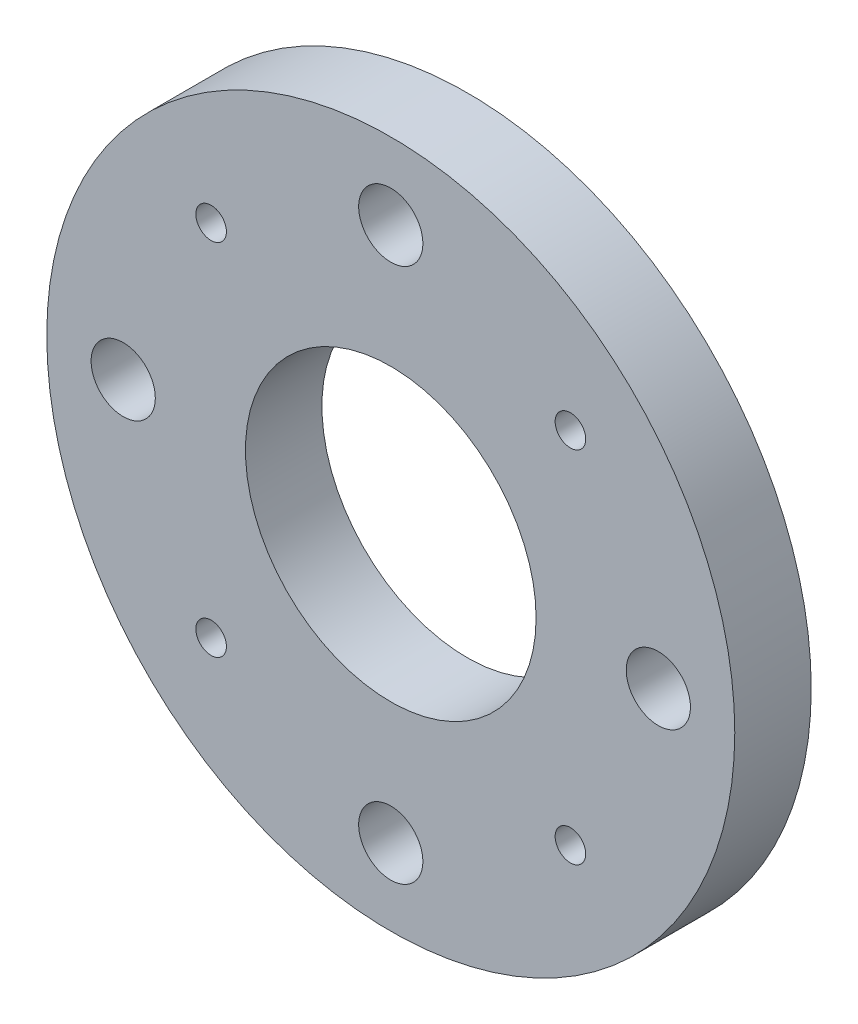
ISO-10303-21;
HEADER;
FILE_DESCRIPTION(('STEP AP214'),'2;1');
FILE_NAME('part.step','',(''),(''),'','','');
FILE_SCHEMA(('AUTOMOTIVE_DESIGN { 1 0 10303 214 1 1 1 1 }'));
ENDSEC;
DATA;
#1=APPLICATION_CONTEXT('core data for automotive mechanical design processes');
#2=APPLICATION_PROTOCOL_DEFINITION('international standard','automotive_design',2000,#1);
#3=PRODUCT_CONTEXT('',#1,'mechanical');
#4=PRODUCT('Part','Part','',(#3));
#5=PRODUCT_RELATED_PRODUCT_CATEGORY('part','',(#4));
#6=PRODUCT_DEFINITION_FORMATION('','',#4);
#7=PRODUCT_DEFINITION_CONTEXT('part definition',#1,'design');
#8=PRODUCT_DEFINITION('design','',#6,#7);
#9=PRODUCT_DEFINITION_SHAPE('','',#8);
#10=(LENGTH_UNIT() NAMED_UNIT(*) SI_UNIT(.MILLI.,.METRE.));
#11=(NAMED_UNIT(*) PLANE_ANGLE_UNIT() SI_UNIT($,.RADIAN.));
#12=(NAMED_UNIT(*) SI_UNIT($,.STERADIAN.) SOLID_ANGLE_UNIT());
#13=UNCERTAINTY_MEASURE_WITH_UNIT(LENGTH_MEASURE(1.E-05),#10,'distance_accuracy_value','');
#14=(GEOMETRIC_REPRESENTATION_CONTEXT(3) GLOBAL_UNCERTAINTY_ASSIGNED_CONTEXT((#13)) GLOBAL_UNIT_ASSIGNED_CONTEXT((#10,
#11,#12)) REPRESENTATION_CONTEXT('',''));
#15=CARTESIAN_POINT('',(0.,0.,0.));
#16=DIRECTION('',(0.,0.,1.));
#17=DIRECTION('',(1.,0.,0.));
#18=AXIS2_PLACEMENT_3D('',#15,#16,#17);
#19=CARTESIAN_POINT('',(0.,0.,10.));
#20=DIRECTION('',(0.,0.,1.));
#21=DIRECTION('',(1.,0.,0.));
#22=AXIS2_PLACEMENT_3D('',#19,#20,#21);
#23=PLANE('',#22);
#24=CARTESIAN_POINT('',(35.,0.,10.));
#25=DIRECTION('',(0.,0.,1.));
#26=DIRECTION('',(1.,0.,0.));
#27=AXIS2_PLACEMENT_3D('',#24,#25,#26);
#28=CIRCLE('',#27,4.2);
#29=CARTESIAN_POINT('',(39.2,0.,10.));
#30=VERTEX_POINT('',#29);
#31=EDGE_CURVE('E174',#30,#30,#28,.T.);
#32=ORIENTED_EDGE('',*,*,#31,.F.);
#33=EDGE_LOOP('',(#32));
#34=FACE_BOUND('',#33,.T.);
#35=CARTESIAN_POINT('',(0.,-35.,10.));
#36=DIRECTION('',(0.,0.,1.));
#37=DIRECTION('',(1.,0.,0.));
#38=AXIS2_PLACEMENT_3D('',#35,#36,#37);
#39=CIRCLE('',#38,4.2);
#40=CARTESIAN_POINT('',(4.2,-35.,10.));
#41=VERTEX_POINT('',#40);
#42=EDGE_CURVE('E176',#41,#41,#39,.T.);
#43=ORIENTED_EDGE('',*,*,#42,.F.);
#44=EDGE_LOOP('',(#43));
#45=FACE_BOUND('',#44,.T.);
#46=CARTESIAN_POINT('',(-35.,0.,10.));
#47=DIRECTION('',(0.,0.,1.));
#48=DIRECTION('',(1.,0.,0.));
#49=AXIS2_PLACEMENT_3D('',#46,#47,#48);
#50=CIRCLE('',#49,4.2);
#51=CARTESIAN_POINT('',(-30.8,0.,10.));
#52=VERTEX_POINT('',#51);
#53=EDGE_CURVE('E184',#52,#52,#50,.T.);
#54=ORIENTED_EDGE('',*,*,#53,.F.);
#55=EDGE_LOOP('',(#54));
#56=FACE_BOUND('',#55,.T.);
#57=CARTESIAN_POINT('',(0.,35.,10.));
#58=DIRECTION('',(0.,0.,1.));
#59=DIRECTION('',(1.,0.,0.));
#60=AXIS2_PLACEMENT_3D('',#57,#58,#59);
#61=CIRCLE('',#60,4.2);
#62=CARTESIAN_POINT('',(4.2,35.,10.));
#63=VERTEX_POINT('',#62);
#64=EDGE_CURVE('E190',#63,#63,#61,.T.);
#65=ORIENTED_EDGE('',*,*,#64,.F.);
#66=EDGE_LOOP('',(#65));
#67=FACE_BOUND('',#66,.T.);
#68=CARTESIAN_POINT('',(-23.5000000000003,23.4999999999999,10.));
#69=DIRECTION('',(0.,0.,1.));
#70=DIRECTION('',(1.,0.,0.));
#71=AXIS2_PLACEMENT_3D('',#68,#69,#70);
#72=CIRCLE('',#71,2.);
#73=CARTESIAN_POINT('',(-21.5000000000003,23.4999999999999,10.));
#74=VERTEX_POINT('',#73);
#75=EDGE_CURVE('E202',#74,#74,#72,.T.);
#76=ORIENTED_EDGE('',*,*,#75,.F.);
#77=EDGE_LOOP('',(#76));
#78=FACE_BOUND('',#77,.T.);
#79=CARTESIAN_POINT('',(23.4999999999997,23.4999999999999,10.));
#80=DIRECTION('',(0.,0.,1.));
#81=DIRECTION('',(1.,0.,0.));
#82=AXIS2_PLACEMENT_3D('',#79,#80,#81);
#83=CIRCLE('',#82,2.);
#84=CARTESIAN_POINT('',(25.4999999999997,23.4999999999999,10.));
#85=VERTEX_POINT('',#84);
#86=EDGE_CURVE('E57',#85,#85,#83,.T.);
#87=ORIENTED_EDGE('',*,*,#86,.F.);
#88=EDGE_LOOP('',(#87));
#89=FACE_BOUND('',#88,.T.);
#90=CARTESIAN_POINT('',(23.4999999999997,-23.5000000000001,10.));
#91=DIRECTION('',(0.,0.,1.));
#92=DIRECTION('',(1.,0.,0.));
#93=AXIS2_PLACEMENT_3D('',#90,#91,#92);
#94=CIRCLE('',#93,2.);
#95=CARTESIAN_POINT('',(25.4999999999997,-23.5000000000001,10.));
#96=VERTEX_POINT('',#95);
#97=EDGE_CURVE('E53',#96,#96,#94,.T.);
#98=ORIENTED_EDGE('',*,*,#97,.F.);
#99=EDGE_LOOP('',(#98));
#100=FACE_BOUND('',#99,.T.);
#101=CARTESIAN_POINT('',(-23.5000000000003,-23.5000000000001,10.));
#102=DIRECTION('',(0.,0.,1.));
#103=DIRECTION('',(1.,0.,0.));
#104=AXIS2_PLACEMENT_3D('',#101,#102,#103);
#105=CIRCLE('',#104,2.);
#106=CARTESIAN_POINT('',(-21.5000000000003,-23.5000000000001,10.));
#107=VERTEX_POINT('',#106);
#108=EDGE_CURVE('E49',#107,#107,#105,.T.);
#109=ORIENTED_EDGE('',*,*,#108,.F.);
#110=EDGE_LOOP('',(#109));
#111=FACE_BOUND('',#110,.T.);
#112=CARTESIAN_POINT('',(0.,0.,10.));
#113=DIRECTION('',(0.,0.,1.));
#114=DIRECTION('',(1.,0.,0.));
#115=AXIS2_PLACEMENT_3D('',#112,#113,#114);
#116=CIRCLE('',#115,45.);
#117=CARTESIAN_POINT('',(45.,0.,10.));
#118=VERTEX_POINT('',#117);
#119=EDGE_CURVE('E10',#118,#118,#116,.T.);
#120=ORIENTED_EDGE('',*,*,#119,.T.);
#121=EDGE_LOOP('',(#120));
#122=FACE_BOUND('',#121,.T.);
#123=CARTESIAN_POINT('',(0.,0.,10.));
#124=DIRECTION('',(0.,0.,1.));
#125=DIRECTION('',(1.,0.,0.));
#126=AXIS2_PLACEMENT_3D('',#123,#124,#125);
#127=CIRCLE('',#126,19.01);
#128=CARTESIAN_POINT('',(19.01,0.,10.));
#129=VERTEX_POINT('',#128);
#130=EDGE_CURVE('E41',#129,#129,#127,.T.);
#131=ORIENTED_EDGE('',*,*,#130,.F.);
#132=EDGE_LOOP('',(#131));
#133=FACE_BOUND('',#132,.T.);
#134=ADVANCED_FACE('F28',(#34,#45,#56,#67,#78,#89,#100,#111,#122,#133),#23,.T.);
#135=CARTESIAN_POINT('',(0.,0.,0.));
#136=DIRECTION('',(0.,0.,1.));
#137=DIRECTION('',(1.,0.,0.));
#138=AXIS2_PLACEMENT_3D('',#135,#136,#137);
#139=PLANE('',#138);
#140=CARTESIAN_POINT('',(35.,0.,0.));
#141=DIRECTION('',(0.,0.,1.));
#142=DIRECTION('',(1.,0.,0.));
#143=AXIS2_PLACEMENT_3D('',#140,#141,#142);
#144=CIRCLE('',#143,4.2);
#145=CARTESIAN_POINT('',(39.2,0.,0.));
#146=VERTEX_POINT('',#145);
#147=EDGE_CURVE('E172',#146,#146,#144,.T.);
#148=ORIENTED_EDGE('',*,*,#147,.T.);
#149=EDGE_LOOP('',(#148));
#150=FACE_BOUND('',#149,.T.);
#151=CARTESIAN_POINT('',(0.,-35.,0.));
#152=DIRECTION('',(0.,0.,1.));
#153=DIRECTION('',(1.,0.,0.));
#154=AXIS2_PLACEMENT_3D('',#151,#152,#153);
#155=CIRCLE('',#154,4.2);
#156=CARTESIAN_POINT('',(4.2,-35.,0.));
#157=VERTEX_POINT('',#156);
#158=EDGE_CURVE('E181',#157,#157,#155,.T.);
#159=ORIENTED_EDGE('',*,*,#158,.T.);
#160=EDGE_LOOP('',(#159));
#161=FACE_BOUND('',#160,.T.);
#162=CARTESIAN_POINT('',(-35.,0.,0.));
#163=DIRECTION('',(0.,0.,1.));
#164=DIRECTION('',(1.,0.,0.));
#165=AXIS2_PLACEMENT_3D('',#162,#163,#164);
#166=CIRCLE('',#165,4.2);
#167=CARTESIAN_POINT('',(-30.8,0.,0.));
#168=VERTEX_POINT('',#167);
#169=EDGE_CURVE('E187',#168,#168,#166,.T.);
#170=ORIENTED_EDGE('',*,*,#169,.T.);
#171=EDGE_LOOP('',(#170));
#172=FACE_BOUND('',#171,.T.);
#173=CARTESIAN_POINT('',(0.,35.,0.));
#174=DIRECTION('',(0.,0.,1.));
#175=DIRECTION('',(1.,0.,0.));
#176=AXIS2_PLACEMENT_3D('',#173,#174,#175);
#177=CIRCLE('',#176,4.2);
#178=CARTESIAN_POINT('',(4.2,35.,0.));
#179=VERTEX_POINT('',#178);
#180=EDGE_CURVE('E193',#179,#179,#177,.T.);
#181=ORIENTED_EDGE('',*,*,#180,.T.);
#182=EDGE_LOOP('',(#181));
#183=FACE_BOUND('',#182,.T.);
#184=CARTESIAN_POINT('',(-23.5000000000003,23.4999999999999,0.));
#185=DIRECTION('',(0.,0.,1.));
#186=DIRECTION('',(1.,0.,0.));
#187=AXIS2_PLACEMENT_3D('',#184,#185,#186);
#188=CIRCLE('',#187,1.65);
#189=CARTESIAN_POINT('',(-21.8500000000003,23.4999999999999,0.));
#190=VERTEX_POINT('',#189);
#191=EDGE_CURVE('E32',#190,#190,#188,.T.);
#192=ORIENTED_EDGE('',*,*,#191,.T.);
#193=EDGE_LOOP('',(#192));
#194=FACE_BOUND('',#193,.T.);
#195=CARTESIAN_POINT('',(23.4999999999997,23.4999999999999,0.));
#196=DIRECTION('',(0.,0.,1.));
#197=DIRECTION('',(1.,0.,0.));
#198=AXIS2_PLACEMENT_3D('',#195,#196,#197);
#199=CIRCLE('',#198,1.65);
#200=CARTESIAN_POINT('',(25.1499999999997,23.4999999999999,0.));
#201=VERTEX_POINT('',#200);
#202=EDGE_CURVE('E54',#201,#201,#199,.T.);
#203=ORIENTED_EDGE('',*,*,#202,.T.);
#204=EDGE_LOOP('',(#203));
#205=FACE_BOUND('',#204,.T.);
#206=CARTESIAN_POINT('',(23.4999999999997,-23.5000000000001,0.));
#207=DIRECTION('',(0.,0.,1.));
#208=DIRECTION('',(1.,0.,0.));
#209=AXIS2_PLACEMENT_3D('',#206,#207,#208);
#210=CIRCLE('',#209,1.65);
#211=CARTESIAN_POINT('',(25.1499999999997,-23.5000000000001,0.));
#212=VERTEX_POINT('',#211);
#213=EDGE_CURVE('E50',#212,#212,#210,.T.);
#214=ORIENTED_EDGE('',*,*,#213,.T.);
#215=EDGE_LOOP('',(#214));
#216=FACE_BOUND('',#215,.T.);
#217=CARTESIAN_POINT('',(-23.5000000000003,-23.5000000000001,0.));
#218=DIRECTION('',(0.,0.,1.));
#219=DIRECTION('',(1.,0.,0.));
#220=AXIS2_PLACEMENT_3D('',#217,#218,#219);
#221=CIRCLE('',#220,1.65);
#222=CARTESIAN_POINT('',(-21.8500000000003,-23.5000000000001,0.));
#223=VERTEX_POINT('',#222);
#224=EDGE_CURVE('E45',#223,#223,#221,.T.);
#225=ORIENTED_EDGE('',*,*,#224,.T.);
#226=EDGE_LOOP('',(#225));
#227=FACE_BOUND('',#226,.T.);
#228=CARTESIAN_POINT('',(0.,0.,0.));
#229=DIRECTION('',(0.,0.,1.));
#230=DIRECTION('',(1.,0.,0.));
#231=AXIS2_PLACEMENT_3D('',#228,#229,#230);
#232=CIRCLE('',#231,45.);
#233=CARTESIAN_POINT('',(45.,0.,0.));
#234=VERTEX_POINT('',#233);
#235=EDGE_CURVE('E36',#234,#234,#232,.T.);
#236=ORIENTED_EDGE('',*,*,#235,.F.);
#237=EDGE_LOOP('',(#236));
#238=FACE_BOUND('',#237,.T.);
#239=CARTESIAN_POINT('',(0.,0.,0.));
#240=DIRECTION('',(0.,0.,1.));
#241=DIRECTION('',(1.,0.,0.));
#242=AXIS2_PLACEMENT_3D('',#239,#240,#241);
#243=CIRCLE('',#242,19.01);
#244=CARTESIAN_POINT('',(19.01,0.,0.));
#245=VERTEX_POINT('',#244);
#246=EDGE_CURVE('E48',#245,#245,#243,.T.);
#247=ORIENTED_EDGE('',*,*,#246,.T.);
#248=EDGE_LOOP('',(#247));
#249=FACE_BOUND('',#248,.T.);
#250=ADVANCED_FACE('F92',(#150,#161,#172,#183,#194,#205,#216,#227,#238,#249),#139,.F.);
#251=CARTESIAN_POINT('',(0.,0.,10.));
#252=DIRECTION('',(0.,0.,-1.));
#253=DIRECTION('',(-1.,0.,0.));
#254=AXIS2_PLACEMENT_3D('',#251,#252,#253);
#255=CYLINDRICAL_SURFACE('',#254,45.);
#256=ORIENTED_EDGE('',*,*,#119,.F.);
#257=EDGE_LOOP('',(#256));
#258=FACE_BOUND('',#257,.T.);
#259=ORIENTED_EDGE('',*,*,#235,.T.);
#260=EDGE_LOOP('',(#259));
#261=FACE_BOUND('',#260,.T.);
#262=ADVANCED_FACE('F30',(#258,#261),#255,.T.);
#263=CARTESIAN_POINT('',(0.,0.,10.));
#264=DIRECTION('',(0.,0.,-1.));
#265=DIRECTION('',(-1.,0.,0.));
#266=AXIS2_PLACEMENT_3D('',#263,#264,#265);
#267=CYLINDRICAL_SURFACE('',#266,19.01);
#268=ORIENTED_EDGE('',*,*,#130,.T.);
#269=EDGE_LOOP('',(#268));
#270=FACE_BOUND('',#269,.T.);
#271=ORIENTED_EDGE('',*,*,#246,.F.);
#272=EDGE_LOOP('',(#271));
#273=FACE_BOUND('',#272,.T.);
#274=ADVANCED_FACE('F88',(#270,#273),#267,.F.);
#275=CARTESIAN_POINT('',(-23.5000000000003,-23.5000000000001,10.));
#276=DIRECTION('',(0.,0.,1.));
#277=DIRECTION('',(1.,0.,0.));
#278=AXIS2_PLACEMENT_3D('',#275,#276,#277);
#279=CYLINDRICAL_SURFACE('',#278,1.65);
#280=CARTESIAN_POINT('',(-23.5000000000003,-23.5000000000001,2.));
#281=DIRECTION('',(0.,0.,1.));
#282=DIRECTION('',(1.,0.,0.));
#283=AXIS2_PLACEMENT_3D('',#280,#281,#282);
#284=CIRCLE('',#283,1.65);
#285=CARTESIAN_POINT('',(-21.8500000000003,-23.5000000000001,2.));
#286=VERTEX_POINT('',#285);
#287=EDGE_CURVE('E52',#286,#286,#284,.T.);
#288=ORIENTED_EDGE('',*,*,#287,.T.);
#289=EDGE_LOOP('',(#288));
#290=FACE_BOUND('',#289,.T.);
#291=ORIENTED_EDGE('',*,*,#224,.F.);
#292=EDGE_LOOP('',(#291));
#293=FACE_BOUND('',#292,.T.);
#294=ADVANCED_FACE('F104',(#290,#293),#279,.F.);
#295=CARTESIAN_POINT('',(-23.5000000000003,-23.5000000000001,10.));
#296=DIRECTION('',(0.,0.,1.));
#297=DIRECTION('',(1.,0.,0.));
#298=AXIS2_PLACEMENT_3D('',#295,#296,#297);
#299=CYLINDRICAL_SURFACE('',#298,2.);
#300=CARTESIAN_POINT('',(-23.5000000000003,-23.5000000000001,2.));
#301=DIRECTION('',(0.,0.,1.));
#302=DIRECTION('',(1.,0.,0.));
#303=AXIS2_PLACEMENT_3D('',#300,#301,#302);
#304=CIRCLE('',#303,2.);
#305=CARTESIAN_POINT('',(-21.5000000000003,-23.5000000000001,2.));
#306=VERTEX_POINT('',#305);
#307=EDGE_CURVE('E79',#306,#306,#304,.T.);
#308=ORIENTED_EDGE('',*,*,#307,.F.);
#309=EDGE_LOOP('',(#308));
#310=FACE_BOUND('',#309,.T.);
#311=ORIENTED_EDGE('',*,*,#108,.T.);
#312=EDGE_LOOP('',(#311));
#313=FACE_BOUND('',#312,.T.);
#314=ADVANCED_FACE('F105',(#310,#313),#299,.F.);
#315=CARTESIAN_POINT('',(-21.8500000000003,-23.5000000000001,2.));
#316=DIRECTION('',(0.,0.,-1.));
#317=DIRECTION('',(-1.,0.,0.));
#318=AXIS2_PLACEMENT_3D('',#315,#316,#317);
#319=PLANE('',#318);
#320=ORIENTED_EDGE('',*,*,#287,.F.);
#321=EDGE_LOOP('',(#320));
#322=FACE_BOUND('',#321,.T.);
#323=ORIENTED_EDGE('',*,*,#307,.T.);
#324=EDGE_LOOP('',(#323));
#325=FACE_BOUND('',#324,.T.);
#326=ADVANCED_FACE('F108',(#322,#325),#319,.F.);
#327=CARTESIAN_POINT('',(23.4999999999997,-23.5000000000001,10.));
#328=DIRECTION('',(0.,0.,1.));
#329=DIRECTION('',(1.,0.,0.));
#330=AXIS2_PLACEMENT_3D('',#327,#328,#329);
#331=CYLINDRICAL_SURFACE('',#330,1.65);
#332=CARTESIAN_POINT('',(23.4999999999997,-23.5000000000001,2.));
#333=DIRECTION('',(0.,0.,1.));
#334=DIRECTION('',(1.,0.,0.));
#335=AXIS2_PLACEMENT_3D('',#332,#333,#334);
#336=CIRCLE('',#335,1.65);
#337=CARTESIAN_POINT('',(25.1499999999997,-23.5000000000001,2.));
#338=VERTEX_POINT('',#337);
#339=EDGE_CURVE('E56',#338,#338,#336,.T.);
#340=ORIENTED_EDGE('',*,*,#339,.T.);
#341=EDGE_LOOP('',(#340));
#342=FACE_BOUND('',#341,.T.);
#343=ORIENTED_EDGE('',*,*,#213,.F.);
#344=EDGE_LOOP('',(#343));
#345=FACE_BOUND('',#344,.T.);
#346=ADVANCED_FACE('F112',(#342,#345),#331,.F.);
#347=CARTESIAN_POINT('',(23.4999999999997,-23.5000000000001,10.));
#348=DIRECTION('',(0.,0.,1.));
#349=DIRECTION('',(1.,0.,0.));
#350=AXIS2_PLACEMENT_3D('',#347,#348,#349);
#351=CYLINDRICAL_SURFACE('',#350,2.);
#352=CARTESIAN_POINT('',(23.4999999999997,-23.5000000000001,2.));
#353=DIRECTION('',(0.,0.,1.));
#354=DIRECTION('',(1.,0.,0.));
#355=AXIS2_PLACEMENT_3D('',#352,#353,#354);
#356=CIRCLE('',#355,2.);
#357=CARTESIAN_POINT('',(25.4999999999997,-23.5000000000001,2.));
#358=VERTEX_POINT('',#357);
#359=EDGE_CURVE('E61',#358,#358,#356,.T.);
#360=ORIENTED_EDGE('',*,*,#359,.F.);
#361=EDGE_LOOP('',(#360));
#362=FACE_BOUND('',#361,.T.);
#363=ORIENTED_EDGE('',*,*,#97,.T.);
#364=EDGE_LOOP('',(#363));
#365=FACE_BOUND('',#364,.T.);
#366=ADVANCED_FACE('F117',(#362,#365),#351,.F.);
#367=CARTESIAN_POINT('',(25.1499999999997,-23.5000000000001,2.));
#368=DIRECTION('',(0.,0.,-1.));
#369=DIRECTION('',(-1.,0.,0.));
#370=AXIS2_PLACEMENT_3D('',#367,#368,#369);
#371=PLANE('',#370);
#372=ORIENTED_EDGE('',*,*,#339,.F.);
#373=EDGE_LOOP('',(#372));
#374=FACE_BOUND('',#373,.T.);
#375=ORIENTED_EDGE('',*,*,#359,.T.);
#376=EDGE_LOOP('',(#375));
#377=FACE_BOUND('',#376,.T.);
#378=ADVANCED_FACE('F120',(#374,#377),#371,.F.);
#379=CARTESIAN_POINT('',(23.4999999999997,23.4999999999999,10.));
#380=DIRECTION('',(0.,0.,1.));
#381=DIRECTION('',(1.,0.,0.));
#382=AXIS2_PLACEMENT_3D('',#379,#380,#381);
#383=CYLINDRICAL_SURFACE('',#382,1.65);
#384=CARTESIAN_POINT('',(23.4999999999997,23.4999999999999,2.));
#385=DIRECTION('',(0.,0.,1.));
#386=DIRECTION('',(1.,0.,0.));
#387=AXIS2_PLACEMENT_3D('',#384,#385,#386);
#388=CIRCLE('',#387,1.65);
#389=CARTESIAN_POINT('',(25.1499999999997,23.4999999999999,2.));
#390=VERTEX_POINT('',#389);
#391=EDGE_CURVE('E69',#390,#390,#388,.T.);
#392=ORIENTED_EDGE('',*,*,#391,.T.);
#393=EDGE_LOOP('',(#392));
#394=FACE_BOUND('',#393,.T.);
#395=ORIENTED_EDGE('',*,*,#202,.F.);
#396=EDGE_LOOP('',(#395));
#397=FACE_BOUND('',#396,.T.);
#398=ADVANCED_FACE('F124',(#394,#397),#383,.F.);
#399=CARTESIAN_POINT('',(23.4999999999997,23.4999999999999,10.));
#400=DIRECTION('',(0.,0.,1.));
#401=DIRECTION('',(1.,0.,0.));
#402=AXIS2_PLACEMENT_3D('',#399,#400,#401);
#403=CYLINDRICAL_SURFACE('',#402,2.);
#404=CARTESIAN_POINT('',(23.4999999999997,23.4999999999999,2.));
#405=DIRECTION('',(0.,0.,1.));
#406=DIRECTION('',(1.,0.,0.));
#407=AXIS2_PLACEMENT_3D('',#404,#405,#406);
#408=CIRCLE('',#407,2.);
#409=CARTESIAN_POINT('',(25.4999999999997,23.4999999999999,2.));
#410=VERTEX_POINT('',#409);
#411=EDGE_CURVE('E64',#410,#410,#408,.T.);
#412=ORIENTED_EDGE('',*,*,#411,.F.);
#413=EDGE_LOOP('',(#412));
#414=FACE_BOUND('',#413,.T.);
#415=ORIENTED_EDGE('',*,*,#86,.T.);
#416=EDGE_LOOP('',(#415));
#417=FACE_BOUND('',#416,.T.);
#418=ADVANCED_FACE('F129',(#414,#417),#403,.F.);
#419=CARTESIAN_POINT('',(25.1499999999997,23.4999999999999,2.));
#420=DIRECTION('',(0.,0.,-1.));
#421=DIRECTION('',(-1.,0.,0.));
#422=AXIS2_PLACEMENT_3D('',#419,#420,#421);
#423=PLANE('',#422);
#424=ORIENTED_EDGE('',*,*,#391,.F.);
#425=EDGE_LOOP('',(#424));
#426=FACE_BOUND('',#425,.T.);
#427=ORIENTED_EDGE('',*,*,#411,.T.);
#428=EDGE_LOOP('',(#427));
#429=FACE_BOUND('',#428,.T.);
#430=ADVANCED_FACE('F132',(#426,#429),#423,.F.);
#431=CARTESIAN_POINT('',(-23.5000000000003,23.4999999999999,10.));
#432=DIRECTION('',(0.,0.,1.));
#433=DIRECTION('',(1.,0.,0.));
#434=AXIS2_PLACEMENT_3D('',#431,#432,#433);
#435=CYLINDRICAL_SURFACE('',#434,1.65);
#436=CARTESIAN_POINT('',(-23.5000000000003,23.4999999999999,2.));
#437=DIRECTION('',(0.,0.,1.));
#438=DIRECTION('',(1.,0.,0.));
#439=AXIS2_PLACEMENT_3D('',#436,#437,#438);
#440=CIRCLE('',#439,1.65);
#441=CARTESIAN_POINT('',(-21.8500000000003,23.4999999999999,2.));
#442=VERTEX_POINT('',#441);
#443=EDGE_CURVE('E196',#442,#442,#440,.T.);
#444=ORIENTED_EDGE('',*,*,#443,.T.);
#445=EDGE_LOOP('',(#444));
#446=FACE_BOUND('',#445,.T.);
#447=ORIENTED_EDGE('',*,*,#191,.F.);
#448=EDGE_LOOP('',(#447));
#449=FACE_BOUND('',#448,.T.);
#450=ADVANCED_FACE('F136',(#446,#449),#435,.F.);
#451=CARTESIAN_POINT('',(-23.5000000000003,23.4999999999999,10.));
#452=DIRECTION('',(0.,0.,1.));
#453=DIRECTION('',(1.,0.,0.));
#454=AXIS2_PLACEMENT_3D('',#451,#452,#453);
#455=CYLINDRICAL_SURFACE('',#454,2.);
#456=CARTESIAN_POINT('',(-23.5000000000003,23.4999999999999,2.));
#457=DIRECTION('',(0.,0.,1.));
#458=DIRECTION('',(1.,0.,0.));
#459=AXIS2_PLACEMENT_3D('',#456,#457,#458);
#460=CIRCLE('',#459,2.);
#461=CARTESIAN_POINT('',(-21.5000000000003,23.4999999999999,2.));
#462=VERTEX_POINT('',#461);
#463=EDGE_CURVE('E199',#462,#462,#460,.T.);
#464=ORIENTED_EDGE('',*,*,#463,.F.);
#465=EDGE_LOOP('',(#464));
#466=FACE_BOUND('',#465,.T.);
#467=ORIENTED_EDGE('',*,*,#75,.T.);
#468=EDGE_LOOP('',(#467));
#469=FACE_BOUND('',#468,.T.);
#470=ADVANCED_FACE('F141',(#466,#469),#455,.F.);
#471=CARTESIAN_POINT('',(-21.8500000000003,23.4999999999999,2.));
#472=DIRECTION('',(0.,0.,-1.));
#473=DIRECTION('',(-1.,0.,0.));
#474=AXIS2_PLACEMENT_3D('',#471,#472,#473);
#475=PLANE('',#474);
#476=ORIENTED_EDGE('',*,*,#443,.F.);
#477=EDGE_LOOP('',(#476));
#478=FACE_BOUND('',#477,.T.);
#479=ORIENTED_EDGE('',*,*,#463,.T.);
#480=EDGE_LOOP('',(#479));
#481=FACE_BOUND('',#480,.T.);
#482=ADVANCED_FACE('F144',(#478,#481),#475,.F.);
#483=CARTESIAN_POINT('',(0.,35.,0.));
#484=DIRECTION('',(0.,0.,1.));
#485=DIRECTION('',(1.,0.,0.));
#486=AXIS2_PLACEMENT_3D('',#483,#484,#485);
#487=CYLINDRICAL_SURFACE('',#486,4.2);
#488=ORIENTED_EDGE('',*,*,#180,.F.);
#489=EDGE_LOOP('',(#488));
#490=FACE_BOUND('',#489,.T.);
#491=ORIENTED_EDGE('',*,*,#64,.T.);
#492=EDGE_LOOP('',(#491));
#493=FACE_BOUND('',#492,.T.);
#494=ADVANCED_FACE('F148',(#490,#493),#487,.F.);
#495=CARTESIAN_POINT('',(-35.,0.,0.));
#496=DIRECTION('',(0.,0.,1.));
#497=DIRECTION('',(1.,0.,0.));
#498=AXIS2_PLACEMENT_3D('',#495,#496,#497);
#499=CYLINDRICAL_SURFACE('',#498,4.2);
#500=ORIENTED_EDGE('',*,*,#169,.F.);
#501=EDGE_LOOP('',(#500));
#502=FACE_BOUND('',#501,.T.);
#503=ORIENTED_EDGE('',*,*,#53,.T.);
#504=EDGE_LOOP('',(#503));
#505=FACE_BOUND('',#504,.T.);
#506=ADVANCED_FACE('F155',(#502,#505),#499,.F.);
#507=CARTESIAN_POINT('',(0.,-35.,0.));
#508=DIRECTION('',(0.,0.,1.));
#509=DIRECTION('',(1.,0.,0.));
#510=AXIS2_PLACEMENT_3D('',#507,#508,#509);
#511=CYLINDRICAL_SURFACE('',#510,4.2);
#512=ORIENTED_EDGE('',*,*,#158,.F.);
#513=EDGE_LOOP('',(#512));
#514=FACE_BOUND('',#513,.T.);
#515=ORIENTED_EDGE('',*,*,#42,.T.);
#516=EDGE_LOOP('',(#515));
#517=FACE_BOUND('',#516,.T.);
#518=ADVANCED_FACE('F159',(#514,#517),#511,.F.);
#519=CARTESIAN_POINT('',(35.,0.,0.));
#520=DIRECTION('',(0.,0.,1.));
#521=DIRECTION('',(1.,0.,0.));
#522=AXIS2_PLACEMENT_3D('',#519,#520,#521);
#523=CYLINDRICAL_SURFACE('',#522,4.2);
#524=ORIENTED_EDGE('',*,*,#147,.F.);
#525=EDGE_LOOP('',(#524));
#526=FACE_BOUND('',#525,.T.);
#527=ORIENTED_EDGE('',*,*,#31,.T.);
#528=EDGE_LOOP('',(#527));
#529=FACE_BOUND('',#528,.T.);
#530=ADVANCED_FACE('F163',(#526,#529),#523,.F.);
#531=CLOSED_SHELL('',(#134,#250,#262,#274,#294,#314,#326,#346,#366,#378,#398,#418,#430,#450,
#470,#482,#494,#506,#518,#530));
#532=MANIFOLD_SOLID_BREP('B2',#531);
#533=ADVANCED_BREP_SHAPE_REPRESENTATION('',(#18,#532),#14);
#534=SHAPE_DEFINITION_REPRESENTATION(#9,#533);
ENDSEC;
END-ISO-10303-21;
